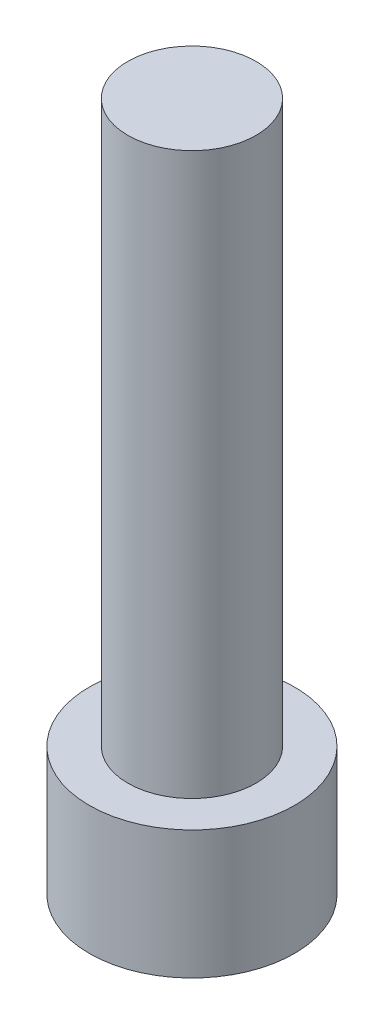
ISO-10303-21;
HEADER;
FILE_DESCRIPTION(('STEP AP214'),'2;1');
FILE_NAME('part.step','',(''),(''),'','','');
FILE_SCHEMA(('AUTOMOTIVE_DESIGN { 1 0 10303 214 1 1 1 1 }'));
ENDSEC;
DATA;
#1=APPLICATION_CONTEXT('core data for automotive mechanical design processes');
#2=APPLICATION_PROTOCOL_DEFINITION('international standard','automotive_design',2000,#1);
#3=PRODUCT_CONTEXT('',#1,'mechanical');
#4=PRODUCT('Part','Part','',(#3));
#5=PRODUCT_RELATED_PRODUCT_CATEGORY('part','',(#4));
#6=PRODUCT_DEFINITION_FORMATION('','',#4);
#7=PRODUCT_DEFINITION_CONTEXT('part definition',#1,'design');
#8=PRODUCT_DEFINITION('design','',#6,#7);
#9=PRODUCT_DEFINITION_SHAPE('','',#8);
#10=(LENGTH_UNIT() NAMED_UNIT(*) SI_UNIT(.MILLI.,.METRE.));
#11=(NAMED_UNIT(*) PLANE_ANGLE_UNIT() SI_UNIT($,.RADIAN.));
#12=(NAMED_UNIT(*) SI_UNIT($,.STERADIAN.) SOLID_ANGLE_UNIT());
#13=UNCERTAINTY_MEASURE_WITH_UNIT(LENGTH_MEASURE(1.E-05),#10,'distance_accuracy_value','');
#14=(GEOMETRIC_REPRESENTATION_CONTEXT(3) GLOBAL_UNCERTAINTY_ASSIGNED_CONTEXT((#13)) GLOBAL_UNIT_ASSIGNED_CONTEXT((#10,
#11,#12)) REPRESENTATION_CONTEXT('',''));
#15=CARTESIAN_POINT('',(0.,0.,0.));
#16=DIRECTION('',(0.,0.,1.));
#17=DIRECTION('',(1.,0.,0.));
#18=AXIS2_PLACEMENT_3D('',#15,#16,#17);
#19=CARTESIAN_POINT('',(0.,8.,0.));
#20=DIRECTION('',(0.,1.,0.));
#21=DIRECTION('',(0.,0.,1.));
#22=AXIS2_PLACEMENT_3D('',#19,#20,#21);
#23=PLANE('',#22);
#24=CARTESIAN_POINT('',(0.,8.,0.));
#25=DIRECTION('',(0.,1.,0.));
#26=DIRECTION('',(0.,0.,1.));
#27=AXIS2_PLACEMENT_3D('',#24,#25,#26);
#28=CIRCLE('',#27,6.4);
#29=CARTESIAN_POINT('',(0.,8.,6.4));
#30=VERTEX_POINT('',#29);
#31=EDGE_CURVE('E11',#30,#30,#28,.T.);
#32=ORIENTED_EDGE('',*,*,#31,.T.);
#33=EDGE_LOOP('',(#32));
#34=FACE_BOUND('',#33,.T.);
#35=CARTESIAN_POINT('',(0.,8.,0.));
#36=DIRECTION('',(0.,1.,0.));
#37=DIRECTION('',(0.,0.,1.));
#38=AXIS2_PLACEMENT_3D('',#35,#36,#37);
#39=CIRCLE('',#38,4.);
#40=CARTESIAN_POINT('',(0.,8.,4.));
#41=VERTEX_POINT('',#40);
#42=EDGE_CURVE('E151',#41,#41,#39,.T.);
#43=ORIENTED_EDGE('',*,*,#42,.F.);
#44=EDGE_LOOP('',(#43));
#45=FACE_BOUND('',#44,.T.);
#46=ADVANCED_FACE('F32',(#34,#45),#23,.T.);
#47=CARTESIAN_POINT('',(0.,8.,0.));
#48=DIRECTION('',(0.,-1.,0.));
#49=DIRECTION('',(0.,0.,-1.));
#50=AXIS2_PLACEMENT_3D('',#47,#48,#49);
#51=CYLINDRICAL_SURFACE('',#50,6.4);
#52=ORIENTED_EDGE('',*,*,#31,.F.);
#53=EDGE_LOOP('',(#52));
#54=FACE_BOUND('',#53,.T.);
#55=CARTESIAN_POINT('',(0.,0.,0.));
#56=DIRECTION('',(0.,1.,0.));
#57=DIRECTION('',(0.,0.,1.));
#58=AXIS2_PLACEMENT_3D('',#55,#56,#57);
#59=CIRCLE('',#58,6.4);
#60=CARTESIAN_POINT('',(0.,0.,6.4));
#61=VERTEX_POINT('',#60);
#62=EDGE_CURVE('E36',#61,#61,#59,.T.);
#63=ORIENTED_EDGE('',*,*,#62,.T.);
#64=EDGE_LOOP('',(#63));
#65=FACE_BOUND('',#64,.T.);
#66=ADVANCED_FACE('F34',(#54,#65),#51,.T.);
#67=CARTESIAN_POINT('',(0.,0.,0.));
#68=DIRECTION('',(0.,1.,0.));
#69=DIRECTION('',(0.,0.,1.));
#70=AXIS2_PLACEMENT_3D('',#67,#68,#69);
#71=PLANE('',#70);
#72=DIRECTION('',(0.99098963597748,0.,0.133938573178983));
#73=VECTOR('',#72,1.);
#74=CARTESIAN_POINT('',(-1.64328584968779,0.,-4.00619665221465));
#75=LINE('',#74,#73);
#76=CARTESIAN_POINT('',(-1.64328584968779,0.,-4.00619665221465));
#77=VERTEX_POINT('',#76);
#78=CARTESIAN_POINT('',(2.64782514853016,0.,-3.42622561761645));
#79=VERTEX_POINT('',#78);
#80=EDGE_CURVE('E121',#77,#79,#75,.T.);
#81=ORIENTED_EDGE('',*,*,#80,.F.);
#82=DIRECTION('',(0.61148902490838,0.,-0.791252913054099));
#83=VECTOR('',#82,1.);
#84=CARTESIAN_POINT('',(-4.29111099821795,0.,-0.579971034598202));
#85=LINE('',#84,#83);
#86=CARTESIAN_POINT('',(-4.29111099821795,0.,-0.579971034598202));
#87=VERTEX_POINT('',#86);
#88=EDGE_CURVE('E47',#87,#77,#85,.T.);
#89=ORIENTED_EDGE('',*,*,#88,.F.);
#90=DIRECTION('',(-0.379500611069099,0.,-0.925191486233083));
#91=VECTOR('',#90,1.);
#92=CARTESIAN_POINT('',(-2.64782514853016,0.,3.42622561761645));
#93=LINE('',#92,#91);
#94=CARTESIAN_POINT('',(-2.64782514853016,0.,3.42622561761645));
#95=VERTEX_POINT('',#94);
#96=EDGE_CURVE('E131',#95,#87,#93,.T.);
#97=ORIENTED_EDGE('',*,*,#96,.F.);
#98=DIRECTION('',(-0.99098963597748,0.,-0.133938573178983));
#99=VECTOR('',#98,1.);
#100=CARTESIAN_POINT('',(1.64328584968779,0.,4.00619665221465));
#101=LINE('',#100,#99);
#102=CARTESIAN_POINT('',(1.64328584968779,0.,4.00619665221465));
#103=VERTEX_POINT('',#102);
#104=EDGE_CURVE('E129',#103,#95,#101,.T.);
#105=ORIENTED_EDGE('',*,*,#104,.F.);
#106=DIRECTION('',(-0.61148902490838,0.,0.791252913054099));
#107=VECTOR('',#106,1.);
#108=CARTESIAN_POINT('',(4.29111099821795,0.,0.579971034598202));
#109=LINE('',#108,#107);
#110=CARTESIAN_POINT('',(4.29111099821795,0.,0.579971034598202));
#111=VERTEX_POINT('',#110);
#112=EDGE_CURVE('E95',#111,#103,#109,.T.);
#113=ORIENTED_EDGE('',*,*,#112,.F.);
#114=DIRECTION('',(0.379500611069099,0.,0.925191486233083));
#115=VECTOR('',#114,1.);
#116=CARTESIAN_POINT('',(2.64782514853016,0.,-3.42622561761645));
#117=LINE('',#116,#115);
#118=EDGE_CURVE('E125',#79,#111,#117,.T.);
#119=ORIENTED_EDGE('',*,*,#118,.F.);
#120=EDGE_LOOP('',(#81,#89,#97,#105,#113,#119));
#121=FACE_BOUND('',#120,.T.);
#122=ORIENTED_EDGE('',*,*,#62,.F.);
#123=EDGE_LOOP('',(#122));
#124=FACE_BOUND('',#123,.T.);
#125=ADVANCED_FACE('F144',(#121,#124),#71,.F.);
#126=CARTESIAN_POINT('',(-4.29111099821795,6.,-0.579971034598202));
#127=DIRECTION('',(-0.791252913054099,0.,-0.61148902490838));
#128=DIRECTION('',(-0.61148902490838,0.,0.7912529130541));
#129=AXIS2_PLACEMENT_3D('',#126,#127,#128);
#130=PLANE('',#129);
#131=ORIENTED_EDGE('',*,*,#88,.T.);
#132=DIRECTION('',(0.,-1.,0.));
#133=VECTOR('',#132,1.);
#134=CARTESIAN_POINT('',(-1.64328584968779,6.,-4.00619665221465));
#135=LINE('',#134,#133);
#136=CARTESIAN_POINT('',(-1.64328584968779,6.,-4.00619665221465));
#137=VERTEX_POINT('',#136);
#138=EDGE_CURVE('E77',#137,#77,#135,.T.);
#139=ORIENTED_EDGE('',*,*,#138,.F.);
#140=DIRECTION('',(0.61148902490838,0.,-0.791252913054099));
#141=VECTOR('',#140,1.);
#142=CARTESIAN_POINT('',(-4.29111099821795,6.,-0.579971034598202));
#143=LINE('',#142,#141);
#144=CARTESIAN_POINT('',(-4.29111099821795,6.,-0.579971034598202));
#145=VERTEX_POINT('',#144);
#146=EDGE_CURVE('E133',#145,#137,#143,.T.);
#147=ORIENTED_EDGE('',*,*,#146,.F.);
#148=DIRECTION('',(0.,-1.,0.));
#149=VECTOR('',#148,1.);
#150=CARTESIAN_POINT('',(-4.29111099821795,6.,-0.579971034598202));
#151=LINE('',#150,#149);
#152=EDGE_CURVE('E55',#145,#87,#151,.T.);
#153=ORIENTED_EDGE('',*,*,#152,.T.);
#154=EDGE_LOOP('',(#131,#139,#147,#153));
#155=FACE_BOUND('',#154,.T.);
#156=ADVANCED_FACE('F173',(#155),#130,.F.);
#157=CARTESIAN_POINT('',(-2.64782514853016,6.,3.42622561761645));
#158=DIRECTION('',(-0.925191486233083,0.,0.379500611069099));
#159=DIRECTION('',(0.379500611069099,0.,0.925191486233083));
#160=AXIS2_PLACEMENT_3D('',#157,#158,#159);
#161=PLANE('',#160);
#162=ORIENTED_EDGE('',*,*,#96,.T.);
#163=ORIENTED_EDGE('',*,*,#152,.F.);
#164=DIRECTION('',(-0.379500611069099,0.,-0.925191486233083));
#165=VECTOR('',#164,1.);
#166=CARTESIAN_POINT('',(-2.64782514853016,6.,3.42622561761645));
#167=LINE('',#166,#165);
#168=CARTESIAN_POINT('',(-2.64782514853016,6.,3.42622561761645));
#169=VERTEX_POINT('',#168);
#170=EDGE_CURVE('E107',#169,#145,#167,.T.);
#171=ORIENTED_EDGE('',*,*,#170,.F.);
#172=DIRECTION('',(0.,-1.,0.));
#173=VECTOR('',#172,1.);
#174=CARTESIAN_POINT('',(-2.64782514853016,6.,3.42622561761645));
#175=LINE('',#174,#173);
#176=EDGE_CURVE('E99',#169,#95,#175,.T.);
#177=ORIENTED_EDGE('',*,*,#176,.T.);
#178=EDGE_LOOP('',(#162,#163,#171,#177));
#179=FACE_BOUND('',#178,.T.);
#180=ADVANCED_FACE('F179',(#179),#161,.F.);
#181=CARTESIAN_POINT('',(1.64328584968779,6.,4.00619665221465));
#182=DIRECTION('',(-0.133938573178983,0.,0.99098963597748));
#183=DIRECTION('',(0.99098963597748,0.,0.133938573178983));
#184=AXIS2_PLACEMENT_3D('',#181,#182,#183);
#185=PLANE('',#184);
#186=ORIENTED_EDGE('',*,*,#104,.T.);
#187=ORIENTED_EDGE('',*,*,#176,.F.);
#188=DIRECTION('',(-0.99098963597748,0.,-0.133938573178983));
#189=VECTOR('',#188,1.);
#190=CARTESIAN_POINT('',(1.64328584968779,6.,4.00619665221465));
#191=LINE('',#190,#189);
#192=CARTESIAN_POINT('',(1.64328584968779,6.,4.00619665221465));
#193=VERTEX_POINT('',#192);
#194=EDGE_CURVE('E103',#193,#169,#191,.T.);
#195=ORIENTED_EDGE('',*,*,#194,.F.);
#196=DIRECTION('',(0.,-1.,0.));
#197=VECTOR('',#196,1.);
#198=CARTESIAN_POINT('',(1.64328584968779,6.,4.00619665221465));
#199=LINE('',#198,#197);
#200=EDGE_CURVE('E88',#193,#103,#199,.T.);
#201=ORIENTED_EDGE('',*,*,#200,.T.);
#202=EDGE_LOOP('',(#186,#187,#195,#201));
#203=FACE_BOUND('',#202,.T.);
#204=ADVANCED_FACE('F104',(#203),#185,.F.);
#205=CARTESIAN_POINT('',(4.29111099821795,6.,0.579971034598202));
#206=DIRECTION('',(0.791252913054099,0.,0.61148902490838));
#207=DIRECTION('',(0.61148902490838,0.,-0.7912529130541));
#208=AXIS2_PLACEMENT_3D('',#205,#206,#207);
#209=PLANE('',#208);
#210=ORIENTED_EDGE('',*,*,#112,.T.);
#211=ORIENTED_EDGE('',*,*,#200,.F.);
#212=DIRECTION('',(-0.61148902490838,0.,0.791252913054099));
#213=VECTOR('',#212,1.);
#214=CARTESIAN_POINT('',(4.29111099821795,6.,0.579971034598202));
#215=LINE('',#214,#213);
#216=CARTESIAN_POINT('',(4.29111099821795,6.,0.579971034598202));
#217=VERTEX_POINT('',#216);
#218=EDGE_CURVE('E92',#217,#193,#215,.T.);
#219=ORIENTED_EDGE('',*,*,#218,.F.);
#220=DIRECTION('',(0.,-1.,0.));
#221=VECTOR('',#220,1.);
#222=CARTESIAN_POINT('',(4.29111099821795,6.,0.579971034598202));
#223=LINE('',#222,#221);
#224=EDGE_CURVE('E100',#217,#111,#223,.T.);
#225=ORIENTED_EDGE('',*,*,#224,.T.);
#226=EDGE_LOOP('',(#210,#211,#219,#225));
#227=FACE_BOUND('',#226,.T.);
#228=ADVANCED_FACE('F90',(#227),#209,.F.);
#229=CARTESIAN_POINT('',(2.64782514853016,6.,-3.42622561761645));
#230=DIRECTION('',(0.925191486233082,0.,-0.379500611069099));
#231=DIRECTION('',(-0.379500611069099,0.,-0.925191486233083));
#232=AXIS2_PLACEMENT_3D('',#229,#230,#231);
#233=PLANE('',#232);
#234=ORIENTED_EDGE('',*,*,#118,.T.);
#235=ORIENTED_EDGE('',*,*,#224,.F.);
#236=DIRECTION('',(0.379500611069099,0.,0.925191486233083));
#237=VECTOR('',#236,1.);
#238=CARTESIAN_POINT('',(2.64782514853016,6.,-3.42622561761645));
#239=LINE('',#238,#237);
#240=CARTESIAN_POINT('',(2.64782514853016,6.,-3.42622561761645));
#241=VERTEX_POINT('',#240);
#242=EDGE_CURVE('E113',#241,#217,#239,.T.);
#243=ORIENTED_EDGE('',*,*,#242,.F.);
#244=DIRECTION('',(0.,-1.,0.));
#245=VECTOR('',#244,1.);
#246=CARTESIAN_POINT('',(2.64782514853016,6.,-3.42622561761645));
#247=LINE('',#246,#245);
#248=EDGE_CURVE('E137',#241,#79,#247,.T.);
#249=ORIENTED_EDGE('',*,*,#248,.T.);
#250=EDGE_LOOP('',(#234,#235,#243,#249));
#251=FACE_BOUND('',#250,.T.);
#252=ADVANCED_FACE('F148',(#251),#233,.F.);
#253=CARTESIAN_POINT('',(-1.64328584968779,6.,-4.00619665221465));
#254=DIRECTION('',(0.133938573178983,0.,-0.99098963597748));
#255=DIRECTION('',(-0.99098963597748,0.,-0.133938573178983));
#256=AXIS2_PLACEMENT_3D('',#253,#254,#255);
#257=PLANE('',#256);
#258=ORIENTED_EDGE('',*,*,#80,.T.);
#259=ORIENTED_EDGE('',*,*,#248,.F.);
#260=DIRECTION('',(0.99098963597748,0.,0.133938573178983));
#261=VECTOR('',#260,1.);
#262=CARTESIAN_POINT('',(-1.64328584968779,6.,-4.00619665221465));
#263=LINE('',#262,#261);
#264=EDGE_CURVE('E115',#137,#241,#263,.T.);
#265=ORIENTED_EDGE('',*,*,#264,.F.);
#266=ORIENTED_EDGE('',*,*,#138,.T.);
#267=EDGE_LOOP('',(#258,#259,#265,#266));
#268=FACE_BOUND('',#267,.T.);
#269=ADVANCED_FACE('F141',(#268),#257,.F.);
#270=CARTESIAN_POINT('',(-1.64328584968779,6.,-4.00619665221465));
#271=DIRECTION('',(0.,-1.,0.));
#272=DIRECTION('',(0.,0.,-1.));
#273=AXIS2_PLACEMENT_3D('',#270,#271,#272);
#274=PLANE('',#273);
#275=ORIENTED_EDGE('',*,*,#146,.T.);
#276=ORIENTED_EDGE('',*,*,#264,.T.);
#277=ORIENTED_EDGE('',*,*,#242,.T.);
#278=ORIENTED_EDGE('',*,*,#218,.T.);
#279=ORIENTED_EDGE('',*,*,#194,.T.);
#280=ORIENTED_EDGE('',*,*,#170,.T.);
#281=EDGE_LOOP('',(#275,#276,#277,#278,#279,#280));
#282=FACE_BOUND('',#281,.T.);
#283=ADVANCED_FACE('F110',(#282),#274,.T.);
#284=CARTESIAN_POINT('',(0.,43.,0.));
#285=DIRECTION('',(0.,-1.,0.));
#286=DIRECTION('',(0.,0.,-1.));
#287=AXIS2_PLACEMENT_3D('',#284,#285,#286);
#288=CYLINDRICAL_SURFACE('',#287,4.);
#289=CARTESIAN_POINT('',(0.,43.,0.));
#290=DIRECTION('',(0.,1.,0.));
#291=DIRECTION('',(0.,0.,1.));
#292=AXIS2_PLACEMENT_3D('',#289,#290,#291);
#293=CIRCLE('',#292,4.);
#294=CARTESIAN_POINT('',(0.,43.,4.));
#295=VERTEX_POINT('',#294);
#296=EDGE_CURVE('E122',#295,#295,#293,.T.);
#297=ORIENTED_EDGE('',*,*,#296,.F.);
#298=EDGE_LOOP('',(#297));
#299=FACE_BOUND('',#298,.T.);
#300=ORIENTED_EDGE('',*,*,#42,.T.);
#301=EDGE_LOOP('',(#300));
#302=FACE_BOUND('',#301,.T.);
#303=ADVANCED_FACE('F159',(#299,#302),#288,.T.);
#304=CARTESIAN_POINT('',(0.,43.,0.));
#305=DIRECTION('',(0.,1.,0.));
#306=DIRECTION('',(0.,0.,1.));
#307=AXIS2_PLACEMENT_3D('',#304,#305,#306);
#308=PLANE('',#307);
#309=ORIENTED_EDGE('',*,*,#296,.T.);
#310=EDGE_LOOP('',(#309));
#311=FACE_BOUND('',#310,.T.);
#312=ADVANCED_FACE('F157',(#311),#308,.T.);
#313=CLOSED_SHELL('',(#46,#66,#125,#156,#180,#204,#228,#252,#269,#283,#303,#312));
#314=MANIFOLD_SOLID_BREP('B2',#313);
#315=ADVANCED_BREP_SHAPE_REPRESENTATION('',(#18,#314),#14);
#316=SHAPE_DEFINITION_REPRESENTATION(#9,#315);
ENDSEC;
END-ISO-10303-21;
